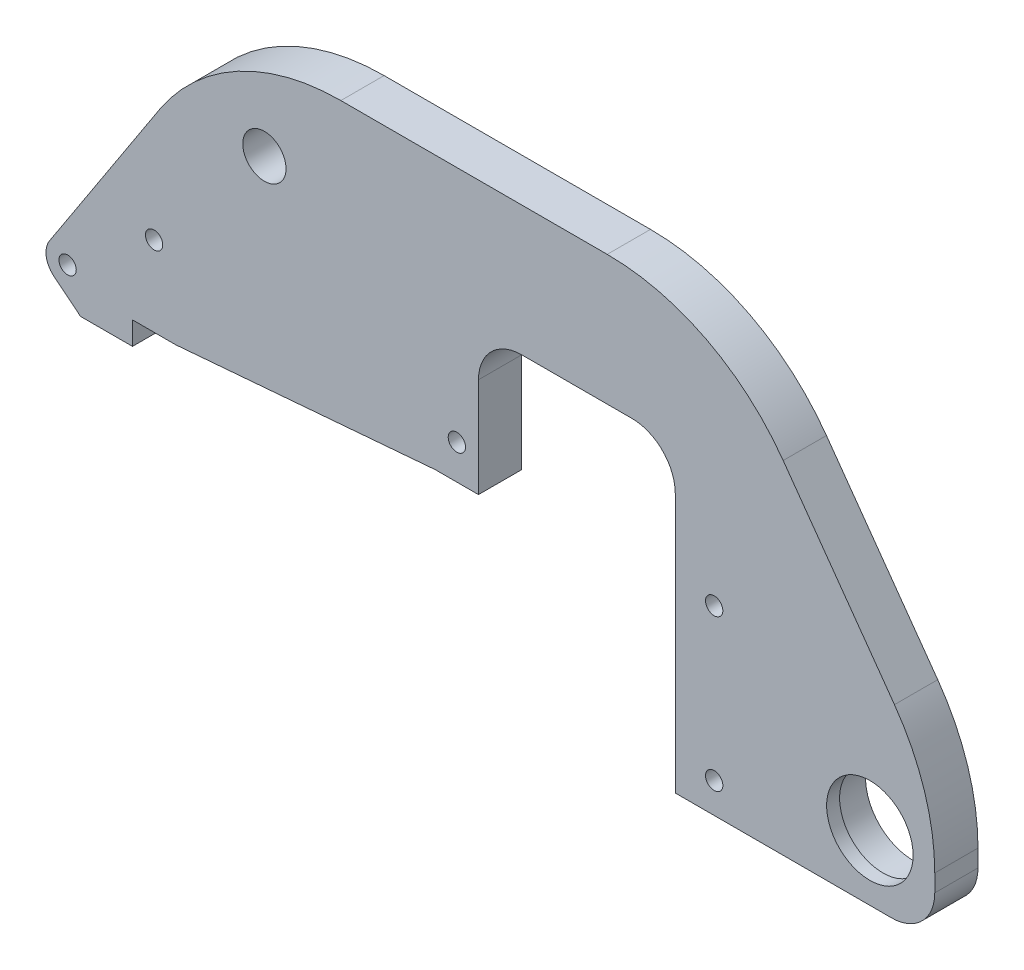
ISO-10303-21;
HEADER;
FILE_DESCRIPTION(('STEP AP214'),'2;1');
FILE_NAME('part.step','',(''),(''),'','','');
FILE_SCHEMA(('AUTOMOTIVE_DESIGN { 1 0 10303 214 1 1 1 1 }'));
ENDSEC;
DATA;
#1=APPLICATION_CONTEXT('core data for automotive mechanical design processes');
#2=APPLICATION_PROTOCOL_DEFINITION('international standard','automotive_design',2000,#1);
#3=PRODUCT_CONTEXT('',#1,'mechanical');
#4=PRODUCT('Part','Part','',(#3));
#5=PRODUCT_RELATED_PRODUCT_CATEGORY('part','',(#4));
#6=PRODUCT_DEFINITION_FORMATION('','',#4);
#7=PRODUCT_DEFINITION_CONTEXT('part definition',#1,'design');
#8=PRODUCT_DEFINITION('design','',#6,#7);
#9=PRODUCT_DEFINITION_SHAPE('','',#8);
#10=(LENGTH_UNIT() NAMED_UNIT(*) SI_UNIT(.MILLI.,.METRE.));
#11=(NAMED_UNIT(*) PLANE_ANGLE_UNIT() SI_UNIT($,.RADIAN.));
#12=(NAMED_UNIT(*) SI_UNIT($,.STERADIAN.) SOLID_ANGLE_UNIT());
#13=UNCERTAINTY_MEASURE_WITH_UNIT(LENGTH_MEASURE(1.E-05),#10,'distance_accuracy_value','');
#14=(GEOMETRIC_REPRESENTATION_CONTEXT(3) GLOBAL_UNCERTAINTY_ASSIGNED_CONTEXT((#13)) GLOBAL_UNIT_ASSIGNED_CONTEXT((#10,
#11,#12)) REPRESENTATION_CONTEXT('',''));
#15=CARTESIAN_POINT('',(0.,0.,0.));
#16=DIRECTION('',(0.,0.,1.));
#17=DIRECTION('',(1.,0.,0.));
#18=AXIS2_PLACEMENT_3D('',#15,#16,#17);
#19=CARTESIAN_POINT('',(95.5,-30.,10.));
#20=DIRECTION('',(0.,0.,-1.));
#21=DIRECTION('',(-1.,0.,0.));
#22=AXIS2_PLACEMENT_3D('',#19,#20,#21);
#23=CYLINDRICAL_SURFACE('',#22,11.);
#24=CARTESIAN_POINT('',(95.5,-30.,0.));
#25=DIRECTION('',(0.,0.,1.));
#26=DIRECTION('',(1.,0.,0.));
#27=AXIS2_PLACEMENT_3D('',#24,#25,#26);
#28=CIRCLE('',#27,11.);
#29=CARTESIAN_POINT('',(106.5,-30.,0.));
#30=VERTEX_POINT('',#29);
#31=EDGE_CURVE('E427',#30,#30,#28,.T.);
#32=ORIENTED_EDGE('',*,*,#31,.F.);
#33=EDGE_LOOP('',(#32));
#34=FACE_BOUND('',#33,.T.);
#35=CARTESIAN_POINT('',(95.5,-30.,7.));
#36=DIRECTION('',(0.,0.,1.));
#37=DIRECTION('',(1.,0.,0.));
#38=AXIS2_PLACEMENT_3D('',#35,#36,#37);
#39=CIRCLE('',#38,11.);
#40=CARTESIAN_POINT('',(106.5,-30.,7.));
#41=VERTEX_POINT('',#40);
#42=EDGE_CURVE('E432',#41,#41,#39,.T.);
#43=ORIENTED_EDGE('',*,*,#42,.T.);
#44=EDGE_LOOP('',(#43));
#45=FACE_BOUND('',#44,.T.);
#46=ADVANCED_FACE('F40',(#34,#45),#23,.F.);
#47=CARTESIAN_POINT('',(0.,-13.,10.));
#48=DIRECTION('',(0.,1.,0.));
#49=DIRECTION('',(0.,0.,1.));
#50=AXIS2_PLACEMENT_3D('',#47,#48,#49);
#51=PLANE('',#50);
#52=DIRECTION('',(1.,0.,0.));
#53=VECTOR('',#52,1.);
#54=CARTESIAN_POINT('',(0.,-13.,0.));
#55=LINE('',#54,#53);
#56=CARTESIAN_POINT('',(-75.,-13.,0.));
#57=VERTEX_POINT('',#56);
#58=CARTESIAN_POINT('',(-65.,-13.,0.));
#59=VERTEX_POINT('',#58);
#60=EDGE_CURVE('E212',#57,#59,#55,.T.);
#61=ORIENTED_EDGE('',*,*,#60,.T.);
#62=DIRECTION('',(0.,0.,-1.));
#63=VECTOR('',#62,1.);
#64=CARTESIAN_POINT('',(-65.,-13.,10.));
#65=LINE('',#64,#63);
#66=CARTESIAN_POINT('',(-65.,-13.,10.));
#67=VERTEX_POINT('',#66);
#68=EDGE_CURVE('E189',#67,#59,#65,.T.);
#69=ORIENTED_EDGE('',*,*,#68,.F.);
#70=DIRECTION('',(1.,0.,0.));
#71=VECTOR('',#70,1.);
#72=CARTESIAN_POINT('',(0.,-13.,10.));
#73=LINE('',#72,#71);
#74=CARTESIAN_POINT('',(-75.,-13.,10.));
#75=VERTEX_POINT('',#74);
#76=EDGE_CURVE('E197',#75,#67,#73,.T.);
#77=ORIENTED_EDGE('',*,*,#76,.F.);
#78=DIRECTION('',(0.,0.,-1.));
#79=VECTOR('',#78,1.);
#80=CARTESIAN_POINT('',(-75.,-13.,10.));
#81=LINE('',#80,#79);
#82=EDGE_CURVE('E337',#75,#57,#81,.T.);
#83=ORIENTED_EDGE('',*,*,#82,.T.);
#84=EDGE_LOOP('',(#61,#69,#77,#83));
#85=FACE_BOUND('',#84,.T.);
#86=ADVANCED_FACE('F210',(#85),#51,.F.);
#87=CARTESIAN_POINT('',(0.627586206896552,-7.53103448275862,10.));
#88=DIRECTION('',(-0.08304547985374,0.99654575824488,0.));
#89=DIRECTION('',(-0.99654575824488,-0.08304547985374,0.));
#90=AXIS2_PLACEMENT_3D('',#87,#88,#89);
#91=PLANE('',#90);
#92=DIRECTION('',(0.99654575824488,0.08304547985374,0.));
#93=VECTOR('',#92,1.);
#94=CARTESIAN_POINT('',(0.627586206896552,-7.53103448275862,0.));
#95=LINE('',#94,#93);
#96=CARTESIAN_POINT('',(-5.,-8.,0.));
#97=VERTEX_POINT('',#96);
#98=EDGE_CURVE('E370',#59,#97,#95,.T.);
#99=ORIENTED_EDGE('',*,*,#98,.T.);
#100=DIRECTION('',(0.,0.,-1.));
#101=VECTOR('',#100,1.);
#102=CARTESIAN_POINT('',(-5.,-8.,10.));
#103=LINE('',#102,#101);
#104=CARTESIAN_POINT('',(-5.,-8.,10.));
#105=VERTEX_POINT('',#104);
#106=EDGE_CURVE('E191',#105,#97,#103,.T.);
#107=ORIENTED_EDGE('',*,*,#106,.F.);
#108=DIRECTION('',(0.99654575824488,0.08304547985374,0.));
#109=VECTOR('',#108,1.);
#110=CARTESIAN_POINT('',(0.627586206896552,-7.53103448275862,10.));
#111=LINE('',#110,#109);
#112=EDGE_CURVE('E184',#67,#105,#111,.T.);
#113=ORIENTED_EDGE('',*,*,#112,.F.);
#114=ORIENTED_EDGE('',*,*,#68,.T.);
#115=EDGE_LOOP('',(#99,#107,#113,#114));
#116=FACE_BOUND('',#115,.T.);
#117=ADVANCED_FACE('F187',(#116),#91,.F.);
#118=CARTESIAN_POINT('',(0.,-8.,10.));
#119=DIRECTION('',(0.,-1.,0.));
#120=DIRECTION('',(1.,0.,0.));
#121=AXIS2_PLACEMENT_3D('',#118,#119,#120);
#122=PLANE('',#121);
#123=DIRECTION('',(-1.,0.,0.));
#124=VECTOR('',#123,1.);
#125=CARTESIAN_POINT('',(0.,-8.,0.));
#126=LINE('',#125,#124);
#127=CARTESIAN_POINT('',(5.,-8.,0.));
#128=VERTEX_POINT('',#127);
#129=EDGE_CURVE('E363',#128,#97,#126,.T.);
#130=ORIENTED_EDGE('',*,*,#129,.F.);
#131=DIRECTION('',(0.,0.,-1.));
#132=VECTOR('',#131,1.);
#133=CARTESIAN_POINT('',(5.,-8.,10.));
#134=LINE('',#133,#132);
#135=CARTESIAN_POINT('',(5.,-8.,10.));
#136=VERTEX_POINT('',#135);
#137=EDGE_CURVE('E221',#136,#128,#134,.T.);
#138=ORIENTED_EDGE('',*,*,#137,.F.);
#139=DIRECTION('',(-1.,0.,0.));
#140=VECTOR('',#139,1.);
#141=CARTESIAN_POINT('',(0.,-8.,10.));
#142=LINE('',#141,#140);
#143=EDGE_CURVE('E196',#136,#105,#142,.T.);
#144=ORIENTED_EDGE('',*,*,#143,.T.);
#145=ORIENTED_EDGE('',*,*,#106,.T.);
#146=EDGE_LOOP('',(#130,#138,#144,#145));
#147=FACE_BOUND('',#146,.T.);
#148=ADVANCED_FACE('F368',(#147),#122,.T.);
#149=CARTESIAN_POINT('',(5.,0.,10.));
#150=DIRECTION('',(-1.,0.,0.));
#151=DIRECTION('',(0.,0.,1.));
#152=AXIS2_PLACEMENT_3D('',#149,#150,#151);
#153=PLANE('',#152);
#154=DIRECTION('',(0.,1.,0.));
#155=VECTOR('',#154,1.);
#156=CARTESIAN_POINT('',(5.,0.,0.));
#157=LINE('',#156,#155);
#158=CARTESIAN_POINT('',(5.,15.,0.));
#159=VERTEX_POINT('',#158);
#160=EDGE_CURVE('E356',#128,#159,#157,.T.);
#161=ORIENTED_EDGE('',*,*,#160,.T.);
#162=DIRECTION('',(0.,0.,-1.));
#163=VECTOR('',#162,1.);
#164=CARTESIAN_POINT('',(5.,15.,10.));
#165=LINE('',#164,#163);
#166=CARTESIAN_POINT('',(5.,15.,10.));
#167=VERTEX_POINT('',#166);
#168=EDGE_CURVE('E244',#159,#167,#165,.F.);
#169=ORIENTED_EDGE('',*,*,#168,.T.);
#170=DIRECTION('',(0.,1.,0.));
#171=VECTOR('',#170,1.);
#172=CARTESIAN_POINT('',(5.,0.,10.));
#173=LINE('',#172,#171);
#174=EDGE_CURVE('E359',#136,#167,#173,.T.);
#175=ORIENTED_EDGE('',*,*,#174,.F.);
#176=ORIENTED_EDGE('',*,*,#137,.T.);
#177=EDGE_LOOP('',(#161,#169,#175,#176));
#178=FACE_BOUND('',#177,.T.);
#179=ADVANCED_FACE('F355',(#178),#153,.F.);
#180=CARTESIAN_POINT('',(0.,25.,10.));
#181=DIRECTION('',(0.,1.,0.));
#182=DIRECTION('',(0.,0.,1.));
#183=AXIS2_PLACEMENT_3D('',#180,#181,#182);
#184=PLANE('',#183);
#185=DIRECTION('',(1.,0.,0.));
#186=VECTOR('',#185,1.);
#187=CARTESIAN_POINT('',(0.,25.,0.));
#188=LINE('',#187,#186);
#189=CARTESIAN_POINT('',(15.,25.,0.));
#190=VERTEX_POINT('',#189);
#191=CARTESIAN_POINT('',(40.5,25.,0.));
#192=VERTEX_POINT('',#191);
#193=EDGE_CURVE('E366',#190,#192,#188,.T.);
#194=ORIENTED_EDGE('',*,*,#193,.T.);
#195=DIRECTION('',(0.,0.,-1.));
#196=VECTOR('',#195,1.);
#197=CARTESIAN_POINT('',(40.5,25.,10.));
#198=LINE('',#197,#196);
#199=CARTESIAN_POINT('',(40.5,25.,10.));
#200=VERTEX_POINT('',#199);
#201=EDGE_CURVE('E241',#192,#200,#198,.F.);
#202=ORIENTED_EDGE('',*,*,#201,.T.);
#203=DIRECTION('',(1.,0.,0.));
#204=VECTOR('',#203,1.);
#205=CARTESIAN_POINT('',(0.,25.,10.));
#206=LINE('',#205,#204);
#207=CARTESIAN_POINT('',(15.,25.,10.));
#208=VERTEX_POINT('',#207);
#209=EDGE_CURVE('E488',#208,#200,#206,.T.);
#210=ORIENTED_EDGE('',*,*,#209,.F.);
#211=DIRECTION('',(0.,0.,-1.));
#212=VECTOR('',#211,1.);
#213=CARTESIAN_POINT('',(15.,25.,0.));
#214=LINE('',#213,#212);
#215=EDGE_CURVE('E237',#208,#190,#214,.T.);
#216=ORIENTED_EDGE('',*,*,#215,.T.);
#217=EDGE_LOOP('',(#194,#202,#210,#216));
#218=FACE_BOUND('',#217,.T.);
#219=ADVANCED_FACE('F539',(#218),#184,.F.);
#220=CARTESIAN_POINT('',(50.5,0.,10.));
#221=DIRECTION('',(-1.,0.,0.));
#222=DIRECTION('',(0.,0.,1.));
#223=AXIS2_PLACEMENT_3D('',#220,#221,#222);
#224=PLANE('',#223);
#225=DIRECTION('',(0.,1.,0.));
#226=VECTOR('',#225,1.);
#227=CARTESIAN_POINT('',(50.5,0.,10.));
#228=LINE('',#227,#226);
#229=CARTESIAN_POINT('',(50.5,-45.,10.));
#230=VERTEX_POINT('',#229);
#231=CARTESIAN_POINT('',(50.5,15.,10.));
#232=VERTEX_POINT('',#231);
#233=EDGE_CURVE('E492',#230,#232,#228,.T.);
#234=ORIENTED_EDGE('',*,*,#233,.T.);
#235=DIRECTION('',(0.,0.,-1.));
#236=VECTOR('',#235,1.);
#237=CARTESIAN_POINT('',(50.5,15.,10.));
#238=LINE('',#237,#236);
#239=CARTESIAN_POINT('',(50.5,15.,0.));
#240=VERTEX_POINT('',#239);
#241=EDGE_CURVE('E233',#232,#240,#238,.T.);
#242=ORIENTED_EDGE('',*,*,#241,.T.);
#243=DIRECTION('',(0.,1.,0.));
#244=VECTOR('',#243,1.);
#245=CARTESIAN_POINT('',(50.5,0.,0.));
#246=LINE('',#245,#244);
#247=CARTESIAN_POINT('',(50.5,-45.,0.));
#248=VERTEX_POINT('',#247);
#249=EDGE_CURVE('E379',#248,#240,#246,.T.);
#250=ORIENTED_EDGE('',*,*,#249,.F.);
#251=DIRECTION('',(0.,0.,-1.));
#252=VECTOR('',#251,1.);
#253=CARTESIAN_POINT('',(50.5,-45.,10.));
#254=LINE('',#253,#252);
#255=EDGE_CURVE('E348',#230,#248,#254,.T.);
#256=ORIENTED_EDGE('',*,*,#255,.F.);
#257=EDGE_LOOP('',(#234,#242,#250,#256));
#258=FACE_BOUND('',#257,.T.);
#259=ADVANCED_FACE('F534',(#258),#224,.T.);
#260=CARTESIAN_POINT('',(0.,-45.,10.));
#261=DIRECTION('',(0.,1.,0.));
#262=DIRECTION('',(0.,0.,1.));
#263=AXIS2_PLACEMENT_3D('',#260,#261,#262);
#264=PLANE('',#263);
#265=DIRECTION('',(1.,0.,0.));
#266=VECTOR('',#265,1.);
#267=CARTESIAN_POINT('',(0.,-45.,0.));
#268=LINE('',#267,#266);
#269=CARTESIAN_POINT('',(100.5,-45.,0.));
#270=VERTEX_POINT('',#269);
#271=EDGE_CURVE('E383',#248,#270,#268,.T.);
#272=ORIENTED_EDGE('',*,*,#271,.T.);
#273=DIRECTION('',(0.,0.,-1.));
#274=VECTOR('',#273,1.);
#275=CARTESIAN_POINT('',(100.5,-45.,10.));
#276=LINE('',#275,#274);
#277=CARTESIAN_POINT('',(100.5,-45.,10.));
#278=VERTEX_POINT('',#277);
#279=EDGE_CURVE('E227',#270,#278,#276,.F.);
#280=ORIENTED_EDGE('',*,*,#279,.T.);
#281=DIRECTION('',(1.,0.,0.));
#282=VECTOR('',#281,1.);
#283=CARTESIAN_POINT('',(0.,-45.,10.));
#284=LINE('',#283,#282);
#285=EDGE_CURVE('E496',#230,#278,#284,.T.);
#286=ORIENTED_EDGE('',*,*,#285,.F.);
#287=ORIENTED_EDGE('',*,*,#255,.T.);
#288=EDGE_LOOP('',(#272,#280,#286,#287));
#289=FACE_BOUND('',#288,.T.);
#290=ADVANCED_FACE('F530',(#289),#264,.F.);
#291=CARTESIAN_POINT('',(110.5,0.,10.));
#292=DIRECTION('',(-1.,0.,0.));
#293=DIRECTION('',(0.,0.,1.));
#294=AXIS2_PLACEMENT_3D('',#291,#292,#293);
#295=PLANE('',#294);
#296=DIRECTION('',(0.,1.,0.));
#297=VECTOR('',#296,1.);
#298=CARTESIAN_POINT('',(110.5,0.,0.));
#299=LINE('',#298,#297);
#300=CARTESIAN_POINT('',(110.5,-35.,0.));
#301=VERTEX_POINT('',#300);
#302=CARTESIAN_POINT('',(110.5,-31.0232526704263,0.));
#303=VERTEX_POINT('',#302);
#304=EDGE_CURVE('E387',#301,#303,#299,.T.);
#305=ORIENTED_EDGE('',*,*,#304,.T.);
#306=DIRECTION('',(0.,0.,-1.));
#307=VECTOR('',#306,1.);
#308=CARTESIAN_POINT('',(110.5,-31.0232526704263,10.));
#309=LINE('',#308,#307);
#310=CARTESIAN_POINT('',(110.5,-31.0232526704263,10.));
#311=VERTEX_POINT('',#310);
#312=EDGE_CURVE('E275',#303,#311,#309,.F.);
#313=ORIENTED_EDGE('',*,*,#312,.T.);
#314=DIRECTION('',(0.,1.,0.));
#315=VECTOR('',#314,1.);
#316=CARTESIAN_POINT('',(110.5,0.,10.));
#317=LINE('',#316,#315);
#318=CARTESIAN_POINT('',(110.5,-35.,10.));
#319=VERTEX_POINT('',#318);
#320=EDGE_CURVE('E500',#319,#311,#317,.T.);
#321=ORIENTED_EDGE('',*,*,#320,.F.);
#322=DIRECTION('',(0.,0.,-1.));
#323=VECTOR('',#322,1.);
#324=CARTESIAN_POINT('',(110.5,-35.,10.));
#325=LINE('',#324,#323);
#326=EDGE_CURVE('E214',#319,#301,#325,.T.);
#327=ORIENTED_EDGE('',*,*,#326,.T.);
#328=EDGE_LOOP('',(#305,#313,#321,#327));
#329=FACE_BOUND('',#328,.T.);
#330=ADVANCED_FACE('F520',(#329),#295,.F.);
#331=CARTESIAN_POINT('',(66.0743243243243,47.195945945946,10.));
#332=DIRECTION('',(-0.813733471206735,-0.581238193719096,0.));
#333=DIRECTION('',(0.581238193719096,-0.813733471206735,0.));
#334=AXIS2_PLACEMENT_3D('',#331,#332,#333);
#335=PLANE('',#334);
#336=DIRECTION('',(-0.581238193719097,0.813733471206735,0.));
#337=VECTOR('',#336,1.);
#338=CARTESIAN_POINT('',(66.0743243243243,47.195945945946,10.));
#339=LINE('',#338,#337);
#340=CARTESIAN_POINT('',(101.186673560337,-1.96134298447148,10.));
#341=VERTEX_POINT('',#340);
#342=CARTESIAN_POINT('',(75.4557787957466,34.0619096859548,10.));
#343=VERTEX_POINT('',#342);
#344=EDGE_CURVE('E416',#341,#343,#339,.T.);
#345=ORIENTED_EDGE('',*,*,#344,.F.);
#346=DIRECTION('',(0.,0.,-1.));
#347=VECTOR('',#346,1.);
#348=CARTESIAN_POINT('',(101.186673560337,-1.96134298447146,10.));
#349=LINE('',#348,#347);
#350=CARTESIAN_POINT('',(101.186673560337,-1.96134298447148,0.));
#351=VERTEX_POINT('',#350);
#352=EDGE_CURVE('E262',#341,#351,#349,.T.);
#353=ORIENTED_EDGE('',*,*,#352,.T.);
#354=DIRECTION('',(-0.581238193719097,0.813733471206735,0.));
#355=VECTOR('',#354,1.);
#356=CARTESIAN_POINT('',(66.0743243243243,47.195945945946,0.));
#357=LINE('',#356,#355);
#358=CARTESIAN_POINT('',(75.4557787957466,34.0619096859548,0.));
#359=VERTEX_POINT('',#358);
#360=EDGE_CURVE('E391',#351,#359,#357,.T.);
#361=ORIENTED_EDGE('',*,*,#360,.T.);
#362=DIRECTION('',(0.,0.,-1.));
#363=VECTOR('',#362,1.);
#364=CARTESIAN_POINT('',(75.4557787957466,34.0619096859548,10.));
#365=LINE('',#364,#363);
#366=EDGE_CURVE('E259',#359,#343,#365,.F.);
#367=ORIENTED_EDGE('',*,*,#366,.T.);
#368=EDGE_LOOP('',(#345,#353,#361,#367));
#369=FACE_BOUND('',#368,.T.);
#370=ADVANCED_FACE('F514',(#369),#335,.F.);
#371=CARTESIAN_POINT('',(0.,55.,10.));
#372=DIRECTION('',(0.,-1.,0.));
#373=DIRECTION('',(1.,0.,0.));
#374=AXIS2_PLACEMENT_3D('',#371,#372,#373);
#375=PLANE('',#374);
#376=DIRECTION('',(-1.,0.,0.));
#377=VECTOR('',#376,1.);
#378=CARTESIAN_POINT('',(0.,55.,10.));
#379=LINE('',#378,#377);
#380=CARTESIAN_POINT('',(34.7691052354098,55.,10.));
#381=VERTEX_POINT('',#380);
#382=CARTESIAN_POINT('',(-26.8226928912783,55.,10.));
#383=VERTEX_POINT('',#382);
#384=EDGE_CURVE('E408',#381,#383,#379,.T.);
#385=ORIENTED_EDGE('',*,*,#384,.F.);
#386=DIRECTION('',(0.,0.,-1.));
#387=VECTOR('',#386,1.);
#388=CARTESIAN_POINT('',(34.7691052354098,55.,10.));
#389=LINE('',#388,#387);
#390=CARTESIAN_POINT('',(34.7691052354098,55.,0.));
#391=VERTEX_POINT('',#390);
#392=EDGE_CURVE('E290',#381,#391,#389,.T.);
#393=ORIENTED_EDGE('',*,*,#392,.T.);
#394=DIRECTION('',(-1.,0.,0.));
#395=VECTOR('',#394,1.);
#396=CARTESIAN_POINT('',(0.,55.,0.));
#397=LINE('',#396,#395);
#398=CARTESIAN_POINT('',(-26.8226928912783,55.,0.));
#399=VERTEX_POINT('',#398);
#400=EDGE_CURVE('E326',#391,#399,#397,.T.);
#401=ORIENTED_EDGE('',*,*,#400,.T.);
#402=DIRECTION('',(0.,0.,-1.));
#403=VECTOR('',#402,1.);
#404=CARTESIAN_POINT('',(-26.8226928912783,55.,10.));
#405=LINE('',#404,#403);
#406=EDGE_CURVE('E287',#399,#383,#405,.F.);
#407=ORIENTED_EDGE('',*,*,#406,.T.);
#408=EDGE_LOOP('',(#385,#393,#401,#407));
#409=FACE_BOUND('',#408,.T.);
#410=ADVANCED_FACE('F400',(#409),#375,.F.);
#411=CARTESIAN_POINT('',(-62.9900008784552,41.074853244322,10.));
#412=DIRECTION('',(0.837644560436287,-0.546215699491968,0.));
#413=DIRECTION('',(0.546215699491968,0.837644560436287,0.));
#414=AXIS2_PLACEMENT_3D('',#411,#412,#413);
#415=PLANE('',#414);
#416=DIRECTION('',(-0.546215699491968,-0.837644560436287,0.));
#417=VECTOR('',#416,1.);
#418=CARTESIAN_POINT('',(-62.9900008784552,41.074853244322,0.));
#419=LINE('',#418,#417);
#420=CARTESIAN_POINT('',(-68.7049209130926,32.3107849745984,0.));
#421=VERTEX_POINT('',#420);
#422=CARTESIAN_POINT('',(-94.1882228021815,-6.76892150254018,0.));
#423=VERTEX_POINT('',#422);
#424=EDGE_CURVE('E320',#421,#423,#419,.T.);
#425=ORIENTED_EDGE('',*,*,#424,.T.);
#426=DIRECTION('',(0.,0.,-1.));
#427=VECTOR('',#426,1.);
#428=CARTESIAN_POINT('',(-94.1882228021815,-6.76892150254018,10.));
#429=LINE('',#428,#427);
#430=CARTESIAN_POINT('',(-94.1882228021815,-6.76892150254018,10.));
#431=VERTEX_POINT('',#430);
#432=EDGE_CURVE('E49',#423,#431,#429,.F.);
#433=ORIENTED_EDGE('',*,*,#432,.T.);
#434=DIRECTION('',(-0.546215699491968,-0.837644560436287,0.));
#435=VECTOR('',#434,1.);
#436=CARTESIAN_POINT('',(-62.9900008784552,41.074853244322,10.));
#437=LINE('',#436,#435);
#438=CARTESIAN_POINT('',(-68.7049209130926,32.3107849745984,10.));
#439=VERTEX_POINT('',#438);
#440=EDGE_CURVE('E407',#439,#431,#437,.T.);
#441=ORIENTED_EDGE('',*,*,#440,.F.);
#442=DIRECTION('',(0.,0.,-1.));
#443=VECTOR('',#442,1.);
#444=CARTESIAN_POINT('',(-68.7049209130926,32.3107849745984,10.));
#445=LINE('',#444,#443);
#446=EDGE_CURVE('E294',#439,#421,#445,.T.);
#447=ORIENTED_EDGE('',*,*,#446,.T.);
#448=EDGE_LOOP('',(#425,#433,#441,#447));
#449=FACE_BOUND('',#448,.T.);
#450=ADVANCED_FACE('F409',(#449),#415,.F.);
#451=CARTESIAN_POINT('',(-43.1865955138008,-53.6225810040117,10.));
#452=DIRECTION('',(0.62724697878628,0.77882040779854,0.));
#453=DIRECTION('',(-0.77882040779854,0.62724697878628,0.));
#454=AXIS2_PLACEMENT_3D('',#451,#452,#453);
#455=PLANE('',#454);
#456=DIRECTION('',(0.77882040779854,-0.62724697878628,0.));
#457=VECTOR('',#456,1.);
#458=CARTESIAN_POINT('',(-43.1865955138008,-53.6225810040117,10.));
#459=LINE('',#458,#457);
#460=CARTESIAN_POINT('',(-93.1362348939314,-13.3941020389927,10.));
#461=VERTEX_POINT('',#460);
#462=CARTESIAN_POINT('',(-87.02,-18.32,10.));
#463=VERTEX_POINT('',#462);
#464=EDGE_CURVE('E311',#461,#463,#459,.T.);
#465=ORIENTED_EDGE('',*,*,#464,.F.);
#466=DIRECTION('',(0.,0.,-1.));
#467=VECTOR('',#466,1.);
#468=CARTESIAN_POINT('',(-93.1362348939314,-13.3941020389927,10.));
#469=LINE('',#468,#467);
#470=CARTESIAN_POINT('',(-93.1362348939314,-13.3941020389927,0.));
#471=VERTEX_POINT('',#470);
#472=EDGE_CURVE('E298',#461,#471,#469,.T.);
#473=ORIENTED_EDGE('',*,*,#472,.T.);
#474=DIRECTION('',(0.77882040779854,-0.62724697878628,0.));
#475=VECTOR('',#474,1.);
#476=CARTESIAN_POINT('',(-43.1865955138008,-53.6225810040117,0.));
#477=LINE('',#476,#475);
#478=CARTESIAN_POINT('',(-87.02,-18.32,0.));
#479=VERTEX_POINT('',#478);
#480=EDGE_CURVE('E309',#471,#479,#477,.T.);
#481=ORIENTED_EDGE('',*,*,#480,.T.);
#482=DIRECTION('',(0.,0.,-1.));
#483=VECTOR('',#482,1.);
#484=CARTESIAN_POINT('',(-87.02,-18.32,10.));
#485=LINE('',#484,#483);
#486=EDGE_CURVE('E345',#463,#479,#485,.T.);
#487=ORIENTED_EDGE('',*,*,#486,.F.);
#488=EDGE_LOOP('',(#465,#473,#481,#487));
#489=FACE_BOUND('',#488,.T.);
#490=ADVANCED_FACE('F307',(#489),#455,.F.);
#491=CARTESIAN_POINT('',(0.,-18.32,10.));
#492=DIRECTION('',(0.,1.,0.));
#493=DIRECTION('',(-1.,0.,0.));
#494=AXIS2_PLACEMENT_3D('',#491,#492,#493);
#495=PLANE('',#494);
#496=DIRECTION('',(1.,0.,0.));
#497=VECTOR('',#496,1.);
#498=CARTESIAN_POINT('',(0.,-18.32,0.));
#499=LINE('',#498,#497);
#500=CARTESIAN_POINT('',(-75.,-18.32,0.));
#501=VERTEX_POINT('',#500);
#502=EDGE_CURVE('E318',#479,#501,#499,.T.);
#503=ORIENTED_EDGE('',*,*,#502,.T.);
#504=DIRECTION('',(0.,0.,-1.));
#505=VECTOR('',#504,1.);
#506=CARTESIAN_POINT('',(-75.,-18.32,10.));
#507=LINE('',#506,#505);
#508=CARTESIAN_POINT('',(-75.,-18.32,10.));
#509=VERTEX_POINT('',#508);
#510=EDGE_CURVE('E340',#509,#501,#507,.T.);
#511=ORIENTED_EDGE('',*,*,#510,.F.);
#512=DIRECTION('',(1.,0.,0.));
#513=VECTOR('',#512,1.);
#514=CARTESIAN_POINT('',(0.,-18.32,10.));
#515=LINE('',#514,#513);
#516=EDGE_CURVE('E414',#463,#509,#515,.T.);
#517=ORIENTED_EDGE('',*,*,#516,.F.);
#518=ORIENTED_EDGE('',*,*,#486,.T.);
#519=EDGE_LOOP('',(#503,#511,#517,#518));
#520=FACE_BOUND('',#519,.T.);
#521=ADVANCED_FACE('F590',(#520),#495,.F.);
#522=CARTESIAN_POINT('',(-75.,0.,10.));
#523=DIRECTION('',(-1.,0.,0.));
#524=DIRECTION('',(0.,0.,1.));
#525=AXIS2_PLACEMENT_3D('',#522,#523,#524);
#526=PLANE('',#525);
#527=DIRECTION('',(0.,1.,0.));
#528=VECTOR('',#527,1.);
#529=CARTESIAN_POINT('',(-75.,0.,0.));
#530=LINE('',#529,#528);
#531=EDGE_CURVE('E324',#501,#57,#530,.T.);
#532=ORIENTED_EDGE('',*,*,#531,.T.);
#533=ORIENTED_EDGE('',*,*,#82,.F.);
#534=DIRECTION('',(0.,1.,0.));
#535=VECTOR('',#534,1.);
#536=CARTESIAN_POINT('',(-75.,0.,10.));
#537=LINE('',#536,#535);
#538=EDGE_CURVE('E203',#509,#75,#537,.T.);
#539=ORIENTED_EDGE('',*,*,#538,.F.);
#540=ORIENTED_EDGE('',*,*,#510,.T.);
#541=EDGE_LOOP('',(#532,#533,#539,#540));
#542=FACE_BOUND('',#541,.T.);
#543=ADVANCED_FACE('F586',(#542),#526,.F.);
#544=CARTESIAN_POINT('',(-90.,-9.5,10.));
#545=DIRECTION('',(0.,0.,-1.));
#546=DIRECTION('',(-1.,0.,0.));
#547=AXIS2_PLACEMENT_3D('',#544,#545,#546);
#548=CYLINDRICAL_SURFACE('',#547,2.);
#549=CARTESIAN_POINT('',(-90.,-9.5,10.));
#550=DIRECTION('',(0.,0.,1.));
#551=DIRECTION('',(1.,0.,0.));
#552=AXIS2_PLACEMENT_3D('',#549,#550,#551);
#553=CIRCLE('',#552,2.);
#554=CARTESIAN_POINT('',(-88.,-9.5,10.));
#555=VERTEX_POINT('',#554);
#556=EDGE_CURVE('E208',#555,#555,#553,.T.);
#557=ORIENTED_EDGE('',*,*,#556,.T.);
#558=EDGE_LOOP('',(#557));
#559=FACE_BOUND('',#558,.T.);
#560=CARTESIAN_POINT('',(-90.,-9.5,0.));
#561=DIRECTION('',(0.,0.,1.));
#562=DIRECTION('',(1.,0.,0.));
#563=AXIS2_PLACEMENT_3D('',#560,#561,#562);
#564=CIRCLE('',#563,2.);
#565=CARTESIAN_POINT('',(-88.,-9.5,0.));
#566=VERTEX_POINT('',#565);
#567=EDGE_CURVE('E444',#566,#566,#564,.T.);
#568=ORIENTED_EDGE('',*,*,#567,.F.);
#569=EDGE_LOOP('',(#568));
#570=FACE_BOUND('',#569,.T.);
#571=ADVANCED_FACE('F589',(#559,#570),#548,.F.);
#572=CARTESIAN_POINT('',(-70.,5.5,10.));
#573=DIRECTION('',(0.,0.,-1.));
#574=DIRECTION('',(-1.,0.,0.));
#575=AXIS2_PLACEMENT_3D('',#572,#573,#574);
#576=CYLINDRICAL_SURFACE('',#575,2.);
#577=CARTESIAN_POINT('',(-70.,5.5,10.));
#578=DIRECTION('',(0.,0.,1.));
#579=DIRECTION('',(1.,0.,0.));
#580=AXIS2_PLACEMENT_3D('',#577,#578,#579);
#581=CIRCLE('',#580,2.);
#582=CARTESIAN_POINT('',(-68.,5.5,10.));
#583=VERTEX_POINT('',#582);
#584=EDGE_CURVE('E477',#583,#583,#581,.T.);
#585=ORIENTED_EDGE('',*,*,#584,.T.);
#586=EDGE_LOOP('',(#585));
#587=FACE_BOUND('',#586,.T.);
#588=CARTESIAN_POINT('',(-70.,5.5,0.));
#589=DIRECTION('',(0.,0.,1.));
#590=DIRECTION('',(1.,0.,0.));
#591=AXIS2_PLACEMENT_3D('',#588,#589,#590);
#592=CIRCLE('',#591,2.);
#593=CARTESIAN_POINT('',(-68.,5.5,0.));
#594=VERTEX_POINT('',#593);
#595=EDGE_CURVE('E440',#594,#594,#592,.T.);
#596=ORIENTED_EDGE('',*,*,#595,.F.);
#597=EDGE_LOOP('',(#596));
#598=FACE_BOUND('',#597,.T.);
#599=ADVANCED_FACE('F619',(#587,#598),#576,.F.);
#600=CARTESIAN_POINT('',(59.5,-3.,10.));
#601=DIRECTION('',(0.,0.,-1.));
#602=DIRECTION('',(-1.,0.,0.));
#603=AXIS2_PLACEMENT_3D('',#600,#601,#602);
#604=CYLINDRICAL_SURFACE('',#603,2.);
#605=CARTESIAN_POINT('',(59.5,-3.,10.));
#606=DIRECTION('',(0.,0.,1.));
#607=DIRECTION('',(1.,0.,0.));
#608=AXIS2_PLACEMENT_3D('',#605,#606,#607);
#609=CIRCLE('',#608,2.);
#610=CARTESIAN_POINT('',(61.5,-3.,10.));
#611=VERTEX_POINT('',#610);
#612=EDGE_CURVE('E473',#611,#611,#609,.T.);
#613=ORIENTED_EDGE('',*,*,#612,.T.);
#614=EDGE_LOOP('',(#613));
#615=FACE_BOUND('',#614,.T.);
#616=CARTESIAN_POINT('',(59.5,-3.,0.));
#617=DIRECTION('',(0.,0.,1.));
#618=DIRECTION('',(1.,0.,0.));
#619=AXIS2_PLACEMENT_3D('',#616,#617,#618);
#620=CIRCLE('',#619,2.);
#621=CARTESIAN_POINT('',(61.5,-3.,0.));
#622=VERTEX_POINT('',#621);
#623=EDGE_CURVE('E436',#622,#622,#620,.T.);
#624=ORIENTED_EDGE('',*,*,#623,.F.);
#625=EDGE_LOOP('',(#624));
#626=FACE_BOUND('',#625,.T.);
#627=ADVANCED_FACE('F622',(#615,#626),#604,.F.);
#628=CARTESIAN_POINT('',(59.5,-38.,10.));
#629=DIRECTION('',(0.,0.,-1.));
#630=DIRECTION('',(-1.,0.,0.));
#631=AXIS2_PLACEMENT_3D('',#628,#629,#630);
#632=CYLINDRICAL_SURFACE('',#631,2.);
#633=CARTESIAN_POINT('',(59.5,-38.,10.));
#634=DIRECTION('',(0.,0.,1.));
#635=DIRECTION('',(1.,0.,0.));
#636=AXIS2_PLACEMENT_3D('',#633,#634,#635);
#637=CIRCLE('',#636,2.);
#638=CARTESIAN_POINT('',(61.5,-38.,10.));
#639=VERTEX_POINT('',#638);
#640=EDGE_CURVE('E336',#639,#639,#637,.T.);
#641=ORIENTED_EDGE('',*,*,#640,.T.);
#642=EDGE_LOOP('',(#641));
#643=FACE_BOUND('',#642,.T.);
#644=CARTESIAN_POINT('',(59.5,-38.,0.));
#645=DIRECTION('',(0.,0.,1.));
#646=DIRECTION('',(1.,0.,0.));
#647=AXIS2_PLACEMENT_3D('',#644,#645,#646);
#648=CIRCLE('',#647,2.);
#649=CARTESIAN_POINT('',(61.5,-38.,0.));
#650=VERTEX_POINT('',#649);
#651=EDGE_CURVE('E431',#650,#650,#648,.T.);
#652=ORIENTED_EDGE('',*,*,#651,.F.);
#653=EDGE_LOOP('',(#652));
#654=FACE_BOUND('',#653,.T.);
#655=ADVANCED_FACE('F566',(#643,#654),#632,.F.);
#656=CARTESIAN_POINT('',(0.,0.,10.));
#657=DIRECTION('',(0.,0.,-1.));
#658=DIRECTION('',(-1.,0.,0.));
#659=AXIS2_PLACEMENT_3D('',#656,#657,#658);
#660=CYLINDRICAL_SURFACE('',#659,2.);
#661=CARTESIAN_POINT('',(0.,0.,10.));
#662=DIRECTION('',(0.,0.,1.));
#663=DIRECTION('',(1.,0.,0.));
#664=AXIS2_PLACEMENT_3D('',#661,#662,#663);
#665=CIRCLE('',#664,2.);
#666=CARTESIAN_POINT('',(2.,0.,10.));
#667=VERTEX_POINT('',#666);
#668=EDGE_CURVE('E341',#667,#667,#665,.T.);
#669=ORIENTED_EDGE('',*,*,#668,.T.);
#670=EDGE_LOOP('',(#669));
#671=FACE_BOUND('',#670,.T.);
#672=CARTESIAN_POINT('',(0.,0.,0.));
#673=DIRECTION('',(0.,0.,1.));
#674=DIRECTION('',(1.,0.,0.));
#675=AXIS2_PLACEMENT_3D('',#672,#673,#674);
#676=CIRCLE('',#675,2.);
#677=CARTESIAN_POINT('',(2.,0.,0.));
#678=VERTEX_POINT('',#677);
#679=EDGE_CURVE('E332',#678,#678,#676,.T.);
#680=ORIENTED_EDGE('',*,*,#679,.F.);
#681=EDGE_LOOP('',(#680));
#682=FACE_BOUND('',#681,.T.);
#683=ADVANCED_FACE('F577',(#671,#682),#660,.F.);
#684=CARTESIAN_POINT('',(0.,0.,10.));
#685=DIRECTION('',(0.,0.,1.));
#686=DIRECTION('',(1.,0.,0.));
#687=AXIS2_PLACEMENT_3D('',#684,#685,#686);
#688=PLANE('',#687);
#689=CARTESIAN_POINT('',(-44.5,35.,10.));
#690=DIRECTION('',(0.,0.,1.));
#691=DIRECTION('',(1.,0.,0.));
#692=AXIS2_PLACEMENT_3D('',#689,#690,#691);
#693=CIRCLE('',#692,5.);
#694=CARTESIAN_POINT('',(-39.5,35.,10.));
#695=VERTEX_POINT('',#694);
#696=EDGE_CURVE('E459',#695,#695,#693,.T.);
#697=ORIENTED_EDGE('',*,*,#696,.F.);
#698=EDGE_LOOP('',(#697));
#699=FACE_BOUND('',#698,.T.);
#700=ORIENTED_EDGE('',*,*,#640,.F.);
#701=EDGE_LOOP('',(#700));
#702=FACE_BOUND('',#701,.T.);
#703=ORIENTED_EDGE('',*,*,#612,.F.);
#704=EDGE_LOOP('',(#703));
#705=FACE_BOUND('',#704,.T.);
#706=ORIENTED_EDGE('',*,*,#584,.F.);
#707=EDGE_LOOP('',(#706));
#708=FACE_BOUND('',#707,.T.);
#709=ORIENTED_EDGE('',*,*,#556,.F.);
#710=EDGE_LOOP('',(#709));
#711=FACE_BOUND('',#710,.T.);
#712=ORIENTED_EDGE('',*,*,#440,.T.);
#713=CARTESIAN_POINT('',(-90.,-9.50000000000002,10.));
#714=DIRECTION('',(0.,0.,1.));
#715=DIRECTION('',(1.,0.,0.));
#716=AXIS2_PLACEMENT_3D('',#713,#714,#715);
#717=CIRCLE('',#716,5.);
#718=EDGE_CURVE('E11',#431,#461,#717,.T.);
#719=ORIENTED_EDGE('',*,*,#718,.T.);
#720=ORIENTED_EDGE('',*,*,#464,.T.);
#721=ORIENTED_EDGE('',*,*,#516,.T.);
#722=ORIENTED_EDGE('',*,*,#538,.T.);
#723=ORIENTED_EDGE('',*,*,#76,.T.);
#724=ORIENTED_EDGE('',*,*,#112,.T.);
#725=ORIENTED_EDGE('',*,*,#143,.F.);
#726=ORIENTED_EDGE('',*,*,#174,.T.);
#727=CARTESIAN_POINT('',(15.,15.,10.));
#728=DIRECTION('',(0.,0.,1.));
#729=DIRECTION('',(1.,0.,0.));
#730=AXIS2_PLACEMENT_3D('',#727,#728,#729);
#731=CIRCLE('',#730,10.);
#732=EDGE_CURVE('E256',#167,#208,#731,.F.);
#733=ORIENTED_EDGE('',*,*,#732,.T.);
#734=ORIENTED_EDGE('',*,*,#209,.T.);
#735=CARTESIAN_POINT('',(40.5,15.,10.));
#736=DIRECTION('',(0.,0.,1.));
#737=DIRECTION('',(1.,0.,0.));
#738=AXIS2_PLACEMENT_3D('',#735,#736,#737);
#739=CIRCLE('',#738,10.);
#740=EDGE_CURVE('E250',#200,#232,#739,.F.);
#741=ORIENTED_EDGE('',*,*,#740,.T.);
#742=ORIENTED_EDGE('',*,*,#233,.F.);
#743=ORIENTED_EDGE('',*,*,#285,.T.);
#744=CARTESIAN_POINT('',(100.5,-35.,10.));
#745=DIRECTION('',(0.,0.,1.));
#746=DIRECTION('',(1.,0.,0.));
#747=AXIS2_PLACEMENT_3D('',#744,#745,#746);
#748=CIRCLE('',#747,10.);
#749=EDGE_CURVE('E230',#278,#319,#748,.T.);
#750=ORIENTED_EDGE('',*,*,#749,.T.);
#751=ORIENTED_EDGE('',*,*,#320,.T.);
#752=CARTESIAN_POINT('',(60.5,-31.0232526704263,10.));
#753=DIRECTION('',(0.,0.,1.));
#754=DIRECTION('',(1.,0.,0.));
#755=AXIS2_PLACEMENT_3D('',#752,#753,#754);
#756=CIRCLE('',#755,50.);
#757=EDGE_CURVE('E284',#311,#341,#756,.T.);
#758=ORIENTED_EDGE('',*,*,#757,.T.);
#759=ORIENTED_EDGE('',*,*,#344,.T.);
#760=CARTESIAN_POINT('',(34.7691052354098,4.99999999999999,10.));
#761=DIRECTION('',(0.,0.,1.));
#762=DIRECTION('',(1.,0.,0.));
#763=AXIS2_PLACEMENT_3D('',#760,#761,#762);
#764=CIRCLE('',#763,50.);
#765=EDGE_CURVE('E281',#343,#381,#764,.T.);
#766=ORIENTED_EDGE('',*,*,#765,.T.);
#767=ORIENTED_EDGE('',*,*,#384,.T.);
#768=CARTESIAN_POINT('',(-26.8226928912783,4.99999999999999,10.));
#769=DIRECTION('',(0.,0.,1.));
#770=DIRECTION('',(1.,0.,0.));
#771=AXIS2_PLACEMENT_3D('',#768,#769,#770);
#772=CIRCLE('',#771,50.);
#773=EDGE_CURVE('E278',#383,#439,#772,.T.);
#774=ORIENTED_EDGE('',*,*,#773,.T.);
#775=EDGE_LOOP('',(#712,#719,#720,#721,#722,#723,#724,#725,#726,#733,#734,#741,#742,#743,#750,
#751,#758,#759,#766,#767,#774));
#776=FACE_BOUND('',#775,.T.);
#777=ORIENTED_EDGE('',*,*,#668,.F.);
#778=EDGE_LOOP('',(#777));
#779=FACE_BOUND('',#778,.T.);
#780=CARTESIAN_POINT('',(95.5,-30.,10.));
#781=DIRECTION('',(0.,0.,1.));
#782=DIRECTION('',(1.,0.,0.));
#783=AXIS2_PLACEMENT_3D('',#780,#781,#782);
#784=CIRCLE('',#783,9.99999999999999);
#785=CARTESIAN_POINT('',(105.5,-30.,10.));
#786=VERTEX_POINT('',#785);
#787=EDGE_CURVE('E455',#786,#786,#784,.T.);
#788=ORIENTED_EDGE('',*,*,#787,.F.);
#789=EDGE_LOOP('',(#788));
#790=FACE_BOUND('',#789,.T.);
#791=ADVANCED_FACE('F200',(#699,#702,#705,#708,#711,#776,#779,#790),#688,.T.);
#792=CARTESIAN_POINT('',(0.,0.,0.));
#793=DIRECTION('',(0.,0.,1.));
#794=DIRECTION('',(1.,0.,0.));
#795=AXIS2_PLACEMENT_3D('',#792,#793,#794);
#796=PLANE('',#795);
#797=CARTESIAN_POINT('',(-44.5,35.,0.));
#798=DIRECTION('',(0.,0.,1.));
#799=DIRECTION('',(1.,0.,0.));
#800=AXIS2_PLACEMENT_3D('',#797,#798,#799);
#801=CIRCLE('',#800,5.);
#802=CARTESIAN_POINT('',(-39.5,35.,0.));
#803=VERTEX_POINT('',#802);
#804=EDGE_CURVE('E463',#803,#803,#801,.T.);
#805=ORIENTED_EDGE('',*,*,#804,.T.);
#806=EDGE_LOOP('',(#805));
#807=FACE_BOUND('',#806,.T.);
#808=ORIENTED_EDGE('',*,*,#31,.T.);
#809=EDGE_LOOP('',(#808));
#810=FACE_BOUND('',#809,.T.);
#811=ORIENTED_EDGE('',*,*,#651,.T.);
#812=EDGE_LOOP('',(#811));
#813=FACE_BOUND('',#812,.T.);
#814=ORIENTED_EDGE('',*,*,#623,.T.);
#815=EDGE_LOOP('',(#814));
#816=FACE_BOUND('',#815,.T.);
#817=ORIENTED_EDGE('',*,*,#595,.T.);
#818=EDGE_LOOP('',(#817));
#819=FACE_BOUND('',#818,.T.);
#820=ORIENTED_EDGE('',*,*,#567,.T.);
#821=EDGE_LOOP('',(#820));
#822=FACE_BOUND('',#821,.T.);
#823=ORIENTED_EDGE('',*,*,#480,.F.);
#824=CARTESIAN_POINT('',(-90.,-9.50000000000002,0.));
#825=DIRECTION('',(0.,0.,1.));
#826=DIRECTION('',(1.,0.,0.));
#827=AXIS2_PLACEMENT_3D('',#824,#825,#826);
#828=CIRCLE('',#827,5.);
#829=EDGE_CURVE('E63',#471,#423,#828,.F.);
#830=ORIENTED_EDGE('',*,*,#829,.T.);
#831=ORIENTED_EDGE('',*,*,#424,.F.);
#832=CARTESIAN_POINT('',(-26.8226928912783,4.99999999999999,0.));
#833=DIRECTION('',(0.,0.,1.));
#834=DIRECTION('',(1.,0.,0.));
#835=AXIS2_PLACEMENT_3D('',#832,#833,#834);
#836=CIRCLE('',#835,50.);
#837=EDGE_CURVE('E266',#421,#399,#836,.F.);
#838=ORIENTED_EDGE('',*,*,#837,.T.);
#839=ORIENTED_EDGE('',*,*,#400,.F.);
#840=CARTESIAN_POINT('',(34.7691052354098,4.99999999999999,0.));
#841=DIRECTION('',(0.,0.,1.));
#842=DIRECTION('',(1.,0.,0.));
#843=AXIS2_PLACEMENT_3D('',#840,#841,#842);
#844=CIRCLE('',#843,50.);
#845=EDGE_CURVE('E269',#391,#359,#844,.F.);
#846=ORIENTED_EDGE('',*,*,#845,.T.);
#847=ORIENTED_EDGE('',*,*,#360,.F.);
#848=CARTESIAN_POINT('',(60.5,-31.0232526704263,0.));
#849=DIRECTION('',(0.,0.,1.));
#850=DIRECTION('',(1.,0.,0.));
#851=AXIS2_PLACEMENT_3D('',#848,#849,#850);
#852=CIRCLE('',#851,50.);
#853=EDGE_CURVE('E272',#351,#303,#852,.F.);
#854=ORIENTED_EDGE('',*,*,#853,.T.);
#855=ORIENTED_EDGE('',*,*,#304,.F.);
#856=CARTESIAN_POINT('',(100.5,-35.,0.));
#857=DIRECTION('',(0.,0.,1.));
#858=DIRECTION('',(1.,0.,0.));
#859=AXIS2_PLACEMENT_3D('',#856,#857,#858);
#860=CIRCLE('',#859,10.);
#861=EDGE_CURVE('E219',#301,#270,#860,.F.);
#862=ORIENTED_EDGE('',*,*,#861,.T.);
#863=ORIENTED_EDGE('',*,*,#271,.F.);
#864=ORIENTED_EDGE('',*,*,#249,.T.);
#865=CARTESIAN_POINT('',(40.5,15.,0.));
#866=DIRECTION('',(0.,0.,1.));
#867=DIRECTION('',(1.,0.,0.));
#868=AXIS2_PLACEMENT_3D('',#865,#866,#867);
#869=CIRCLE('',#868,10.);
#870=EDGE_CURVE('E247',#240,#192,#869,.T.);
#871=ORIENTED_EDGE('',*,*,#870,.T.);
#872=ORIENTED_EDGE('',*,*,#193,.F.);
#873=CARTESIAN_POINT('',(15.,15.,0.));
#874=DIRECTION('',(0.,0.,1.));
#875=DIRECTION('',(1.,0.,0.));
#876=AXIS2_PLACEMENT_3D('',#873,#874,#875);
#877=CIRCLE('',#876,10.);
#878=EDGE_CURVE('E253',#190,#159,#877,.T.);
#879=ORIENTED_EDGE('',*,*,#878,.T.);
#880=ORIENTED_EDGE('',*,*,#160,.F.);
#881=ORIENTED_EDGE('',*,*,#129,.T.);
#882=ORIENTED_EDGE('',*,*,#98,.F.);
#883=ORIENTED_EDGE('',*,*,#60,.F.);
#884=ORIENTED_EDGE('',*,*,#531,.F.);
#885=ORIENTED_EDGE('',*,*,#502,.F.);
#886=EDGE_LOOP('',(#823,#830,#831,#838,#839,#846,#847,#854,#855,#862,#863,#864,#871,#872,#879,
#880,#881,#882,#883,#884,#885));
#887=FACE_BOUND('',#886,.T.);
#888=ORIENTED_EDGE('',*,*,#679,.T.);
#889=EDGE_LOOP('',(#888));
#890=FACE_BOUND('',#889,.T.);
#891=ADVANCED_FACE('F315',(#807,#810,#813,#816,#819,#822,#887,#890),#796,.F.);
#892=CARTESIAN_POINT('',(100.5,-35.,10.));
#893=DIRECTION('',(0.,0.,-1.));
#894=DIRECTION('',(-1.,0.,0.));
#895=AXIS2_PLACEMENT_3D('',#892,#893,#894);
#896=CYLINDRICAL_SURFACE('',#895,10.);
#897=ORIENTED_EDGE('',*,*,#749,.F.);
#898=ORIENTED_EDGE('',*,*,#279,.F.);
#899=ORIENTED_EDGE('',*,*,#861,.F.);
#900=ORIENTED_EDGE('',*,*,#326,.F.);
#901=EDGE_LOOP('',(#897,#898,#899,#900));
#902=FACE_BOUND('',#901,.T.);
#903=ADVANCED_FACE('F525',(#902),#896,.T.);
#904=CARTESIAN_POINT('',(40.5,15.,10.));
#905=DIRECTION('',(0.,0.,-1.));
#906=DIRECTION('',(-1.,0.,0.));
#907=AXIS2_PLACEMENT_3D('',#904,#905,#906);
#908=CYLINDRICAL_SURFACE('',#907,10.);
#909=ORIENTED_EDGE('',*,*,#740,.F.);
#910=ORIENTED_EDGE('',*,*,#201,.F.);
#911=ORIENTED_EDGE('',*,*,#870,.F.);
#912=ORIENTED_EDGE('',*,*,#241,.F.);
#913=EDGE_LOOP('',(#909,#910,#911,#912));
#914=FACE_BOUND('',#913,.T.);
#915=ADVANCED_FACE('F543',(#914),#908,.F.);
#916=CARTESIAN_POINT('',(15.,15.,10.));
#917=DIRECTION('',(0.,0.,1.));
#918=DIRECTION('',(1.,0.,0.));
#919=AXIS2_PLACEMENT_3D('',#916,#917,#918);
#920=CYLINDRICAL_SURFACE('',#919,10.);
#921=ORIENTED_EDGE('',*,*,#732,.F.);
#922=ORIENTED_EDGE('',*,*,#168,.F.);
#923=ORIENTED_EDGE('',*,*,#878,.F.);
#924=ORIENTED_EDGE('',*,*,#215,.F.);
#925=EDGE_LOOP('',(#921,#922,#923,#924));
#926=FACE_BOUND('',#925,.T.);
#927=ADVANCED_FACE('F546',(#926),#920,.F.);
#928=CARTESIAN_POINT('',(60.5,-31.0232526704263,10.));
#929=DIRECTION('',(0.,0.,-1.));
#930=DIRECTION('',(-1.,0.,0.));
#931=AXIS2_PLACEMENT_3D('',#928,#929,#930);
#932=CYLINDRICAL_SURFACE('',#931,50.);
#933=ORIENTED_EDGE('',*,*,#757,.F.);
#934=ORIENTED_EDGE('',*,*,#312,.F.);
#935=ORIENTED_EDGE('',*,*,#853,.F.);
#936=ORIENTED_EDGE('',*,*,#352,.F.);
#937=EDGE_LOOP('',(#933,#934,#935,#936));
#938=FACE_BOUND('',#937,.T.);
#939=ADVANCED_FACE('F516',(#938),#932,.T.);
#940=CARTESIAN_POINT('',(34.7691052354098,4.99999999999999,10.));
#941=DIRECTION('',(0.,0.,-1.));
#942=DIRECTION('',(-1.,0.,0.));
#943=AXIS2_PLACEMENT_3D('',#940,#941,#942);
#944=CYLINDRICAL_SURFACE('',#943,50.);
#945=ORIENTED_EDGE('',*,*,#765,.F.);
#946=ORIENTED_EDGE('',*,*,#366,.F.);
#947=ORIENTED_EDGE('',*,*,#845,.F.);
#948=ORIENTED_EDGE('',*,*,#392,.F.);
#949=EDGE_LOOP('',(#945,#946,#947,#948));
#950=FACE_BOUND('',#949,.T.);
#951=ADVANCED_FACE('F512',(#950),#944,.T.);
#952=CARTESIAN_POINT('',(-26.8226928912783,4.99999999999999,10.));
#953=DIRECTION('',(0.,0.,-1.));
#954=DIRECTION('',(-1.,0.,0.));
#955=AXIS2_PLACEMENT_3D('',#952,#953,#954);
#956=CYLINDRICAL_SURFACE('',#955,50.);
#957=ORIENTED_EDGE('',*,*,#773,.F.);
#958=ORIENTED_EDGE('',*,*,#406,.F.);
#959=ORIENTED_EDGE('',*,*,#837,.F.);
#960=ORIENTED_EDGE('',*,*,#446,.F.);
#961=EDGE_LOOP('',(#957,#958,#959,#960));
#962=FACE_BOUND('',#961,.T.);
#963=ADVANCED_FACE('F405',(#962),#956,.T.);
#964=CARTESIAN_POINT('',(-90.,-9.50000000000002,10.));
#965=DIRECTION('',(0.,0.,-1.));
#966=DIRECTION('',(-1.,0.,0.));
#967=AXIS2_PLACEMENT_3D('',#964,#965,#966);
#968=CYLINDRICAL_SURFACE('',#967,5.);
#969=ORIENTED_EDGE('',*,*,#718,.F.);
#970=ORIENTED_EDGE('',*,*,#432,.F.);
#971=ORIENTED_EDGE('',*,*,#829,.F.);
#972=ORIENTED_EDGE('',*,*,#472,.F.);
#973=EDGE_LOOP('',(#969,#970,#971,#972));
#974=FACE_BOUND('',#973,.T.);
#975=ADVANCED_FACE('F42',(#974),#968,.T.);
#976=CARTESIAN_POINT('',(95.5,-30.,7.));
#977=DIRECTION('',(0.,0.,1.));
#978=DIRECTION('',(1.,0.,0.));
#979=AXIS2_PLACEMENT_3D('',#976,#977,#978);
#980=PLANE('',#979);
#981=CARTESIAN_POINT('',(95.5,-30.,7.));
#982=DIRECTION('',(0.,0.,1.));
#983=DIRECTION('',(1.,0.,0.));
#984=AXIS2_PLACEMENT_3D('',#981,#982,#983);
#985=CIRCLE('',#984,9.99999999999999);
#986=CARTESIAN_POINT('',(105.5,-30.,7.));
#987=VERTEX_POINT('',#986);
#988=EDGE_CURVE('E451',#987,#987,#985,.T.);
#989=ORIENTED_EDGE('',*,*,#988,.T.);
#990=EDGE_LOOP('',(#989));
#991=FACE_BOUND('',#990,.T.);
#992=ORIENTED_EDGE('',*,*,#42,.F.);
#993=EDGE_LOOP('',(#992));
#994=FACE_BOUND('',#993,.T.);
#995=ADVANCED_FACE('F716',(#991,#994),#980,.F.);
#996=CARTESIAN_POINT('',(95.5,-30.,7.));
#997=DIRECTION('',(0.,0.,1.));
#998=DIRECTION('',(1.,0.,0.));
#999=AXIS2_PLACEMENT_3D('',#996,#997,#998);
#1000=CYLINDRICAL_SURFACE('',#999,9.99999999999999);
#1001=ORIENTED_EDGE('',*,*,#988,.F.);
#1002=EDGE_LOOP('',(#1001));
#1003=FACE_BOUND('',#1002,.T.);
#1004=ORIENTED_EDGE('',*,*,#787,.T.);
#1005=EDGE_LOOP('',(#1004));
#1006=FACE_BOUND('',#1005,.T.);
#1007=ADVANCED_FACE('F725',(#1003,#1006),#1000,.F.);
#1008=CARTESIAN_POINT('',(-44.5,35.,0.));
#1009=DIRECTION('',(0.,0.,1.));
#1010=DIRECTION('',(1.,0.,0.));
#1011=AXIS2_PLACEMENT_3D('',#1008,#1009,#1010);
#1012=CYLINDRICAL_SURFACE('',#1011,5.);
#1013=ORIENTED_EDGE('',*,*,#696,.T.);
#1014=EDGE_LOOP('',(#1013));
#1015=FACE_BOUND('',#1014,.T.);
#1016=ORIENTED_EDGE('',*,*,#804,.F.);
#1017=EDGE_LOOP('',(#1016));
#1018=FACE_BOUND('',#1017,.T.);
#1019=ADVANCED_FACE('F733',(#1015,#1018),#1012,.F.);
#1020=CLOSED_SHELL('',(#46,#86,#117,#148,#179,#219,#259,#290,#330,#370,#410,#450,#490,#521,#543,
#571,#599,#627,#655,#683,#791,#891,#903,#915,#927,#939,#951,#963,#975,#995,#1007,#1019));
#1021=MANIFOLD_SOLID_BREP('B2',#1020);
#1022=ADVANCED_BREP_SHAPE_REPRESENTATION('',(#18,#1021),#14);
#1023=SHAPE_DEFINITION_REPRESENTATION(#9,#1022);
ENDSEC;
END-ISO-10303-21;
